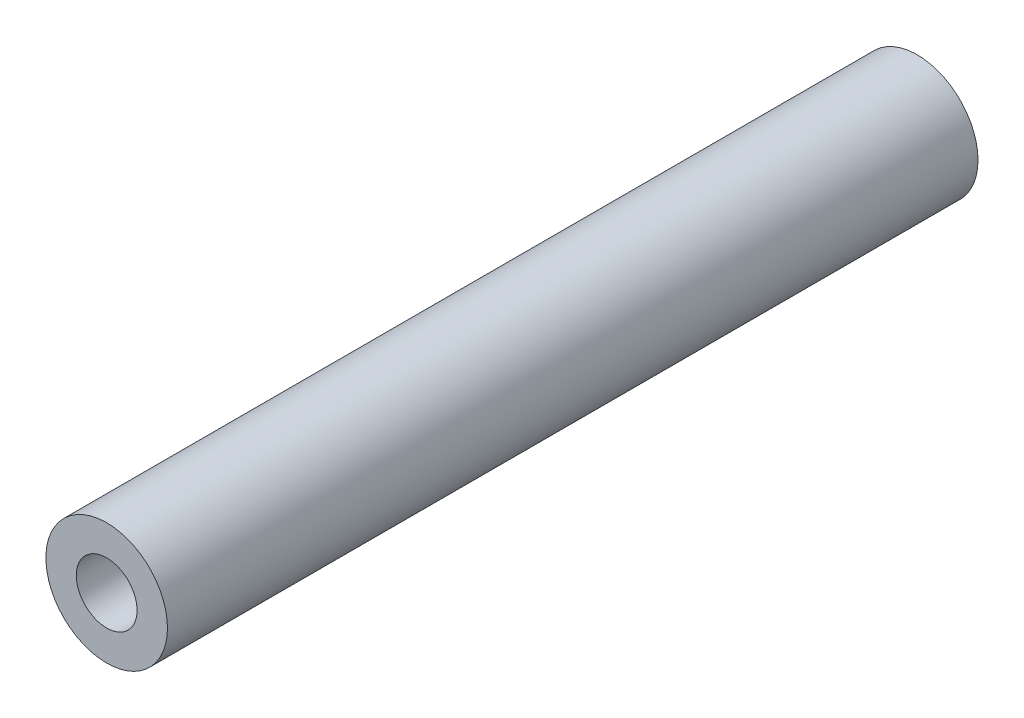
ISO-10303-21;
HEADER;
FILE_DESCRIPTION(('STEP AP214'),'2;1');
FILE_NAME('part.step','',(''),(''),'','','');
FILE_SCHEMA(('AUTOMOTIVE_DESIGN { 1 0 10303 214 1 1 1 1 }'));
ENDSEC;
DATA;
#1=APPLICATION_CONTEXT('core data for automotive mechanical design processes');
#2=APPLICATION_PROTOCOL_DEFINITION('international standard','automotive_design',2000,#1);
#3=PRODUCT_CONTEXT('',#1,'mechanical');
#4=PRODUCT('Part','Part','',(#3));
#5=PRODUCT_RELATED_PRODUCT_CATEGORY('part','',(#4));
#6=PRODUCT_DEFINITION_FORMATION('','',#4);
#7=PRODUCT_DEFINITION_CONTEXT('part definition',#1,'design');
#8=PRODUCT_DEFINITION('design','',#6,#7);
#9=PRODUCT_DEFINITION_SHAPE('','',#8);
#10=(LENGTH_UNIT() NAMED_UNIT(*) SI_UNIT(.MILLI.,.METRE.));
#11=(NAMED_UNIT(*) PLANE_ANGLE_UNIT() SI_UNIT($,.RADIAN.));
#12=(NAMED_UNIT(*) SI_UNIT($,.STERADIAN.) SOLID_ANGLE_UNIT());
#13=UNCERTAINTY_MEASURE_WITH_UNIT(LENGTH_MEASURE(1.E-05),#10,'distance_accuracy_value','');
#14=(GEOMETRIC_REPRESENTATION_CONTEXT(3) GLOBAL_UNCERTAINTY_ASSIGNED_CONTEXT((#13)) GLOBAL_UNIT_ASSIGNED_CONTEXT((#10,
#11,#12)) REPRESENTATION_CONTEXT('',''));
#15=CARTESIAN_POINT('',(0.,0.,0.));
#16=DIRECTION('',(0.,0.,1.));
#17=DIRECTION('',(1.,0.,0.));
#18=AXIS2_PLACEMENT_3D('',#15,#16,#17);
#19=CARTESIAN_POINT('',(0.,0.,40.));
#20=DIRECTION('',(0.,0.,1.));
#21=DIRECTION('',(1.,0.,0.));
#22=AXIS2_PLACEMENT_3D('',#19,#20,#21);
#23=PLANE('',#22);
#24=CARTESIAN_POINT('',(0.,0.,40.));
#25=DIRECTION('',(0.,0.,1.));
#26=DIRECTION('',(1.,0.,0.));
#27=AXIS2_PLACEMENT_3D('',#24,#25,#26);
#28=CIRCLE('',#27,3.);
#29=CARTESIAN_POINT('',(3.,0.,40.));
#30=VERTEX_POINT('',#29);
#31=EDGE_CURVE('E10',#30,#30,#28,.T.);
#32=ORIENTED_EDGE('',*,*,#31,.T.);
#33=EDGE_LOOP('',(#32));
#34=FACE_BOUND('',#33,.T.);
#35=CARTESIAN_POINT('',(0.,0.,40.));
#36=DIRECTION('',(0.,0.,1.));
#37=DIRECTION('',(1.,0.,0.));
#38=AXIS2_PLACEMENT_3D('',#35,#36,#37);
#39=CIRCLE('',#38,1.5);
#40=CARTESIAN_POINT('',(1.5,0.,40.));
#41=VERTEX_POINT('',#40);
#42=EDGE_CURVE('E50',#41,#41,#39,.T.);
#43=ORIENTED_EDGE('',*,*,#42,.F.);
#44=EDGE_LOOP('',(#43));
#45=FACE_BOUND('',#44,.T.);
#46=ADVANCED_FACE('F39',(#34,#45),#23,.T.);
#47=CARTESIAN_POINT('',(0.,0.,0.));
#48=DIRECTION('',(0.,0.,1.));
#49=DIRECTION('',(1.,0.,0.));
#50=AXIS2_PLACEMENT_3D('',#47,#48,#49);
#51=PLANE('',#50);
#52=CARTESIAN_POINT('',(0.,0.,0.));
#53=DIRECTION('',(0.,0.,1.));
#54=DIRECTION('',(1.,0.,0.));
#55=AXIS2_PLACEMENT_3D('',#52,#53,#54);
#56=CIRCLE('',#55,3.);
#57=CARTESIAN_POINT('',(3.,0.,0.));
#58=VERTEX_POINT('',#57);
#59=EDGE_CURVE('E43',#58,#58,#56,.T.);
#60=ORIENTED_EDGE('',*,*,#59,.F.);
#61=EDGE_LOOP('',(#60));
#62=FACE_BOUND('',#61,.T.);
#63=CARTESIAN_POINT('',(0.,0.,0.));
#64=DIRECTION('',(0.,0.,1.));
#65=DIRECTION('',(1.,0.,0.));
#66=AXIS2_PLACEMENT_3D('',#63,#64,#65);
#67=CIRCLE('',#66,1.5);
#68=CARTESIAN_POINT('',(1.5,0.,0.));
#69=VERTEX_POINT('',#68);
#70=EDGE_CURVE('E52',#69,#69,#67,.T.);
#71=ORIENTED_EDGE('',*,*,#70,.T.);
#72=EDGE_LOOP('',(#71));
#73=FACE_BOUND('',#72,.T.);
#74=ADVANCED_FACE('F62',(#62,#73),#51,.F.);
#75=CARTESIAN_POINT('',(0.,0.,40.));
#76=DIRECTION('',(0.,0.,-1.));
#77=DIRECTION('',(-1.,0.,0.));
#78=AXIS2_PLACEMENT_3D('',#75,#76,#77);
#79=CYLINDRICAL_SURFACE('',#78,3.);
#80=ORIENTED_EDGE('',*,*,#31,.F.);
#81=EDGE_LOOP('',(#80));
#82=FACE_BOUND('',#81,.T.);
#83=ORIENTED_EDGE('',*,*,#59,.T.);
#84=EDGE_LOOP('',(#83));
#85=FACE_BOUND('',#84,.T.);
#86=ADVANCED_FACE('F41',(#82,#85),#79,.T.);
#87=CARTESIAN_POINT('',(0.,0.,40.));
#88=DIRECTION('',(0.,0.,-1.));
#89=DIRECTION('',(-1.,0.,0.));
#90=AXIS2_PLACEMENT_3D('',#87,#88,#89);
#91=CYLINDRICAL_SURFACE('',#90,1.5);
#92=ORIENTED_EDGE('',*,*,#42,.T.);
#93=EDGE_LOOP('',(#92));
#94=FACE_BOUND('',#93,.T.);
#95=ORIENTED_EDGE('',*,*,#70,.F.);
#96=EDGE_LOOP('',(#95));
#97=FACE_BOUND('',#96,.T.);
#98=ADVANCED_FACE('F58',(#94,#97),#91,.F.);
#99=CLOSED_SHELL('',(#46,#74,#86,#98));
#100=MANIFOLD_SOLID_BREP('B2',#99);
#101=ADVANCED_BREP_SHAPE_REPRESENTATION('',(#18,#100),#14);
#102=SHAPE_DEFINITION_REPRESENTATION(#9,#101);
ENDSEC;
END-ISO-10303-21;
